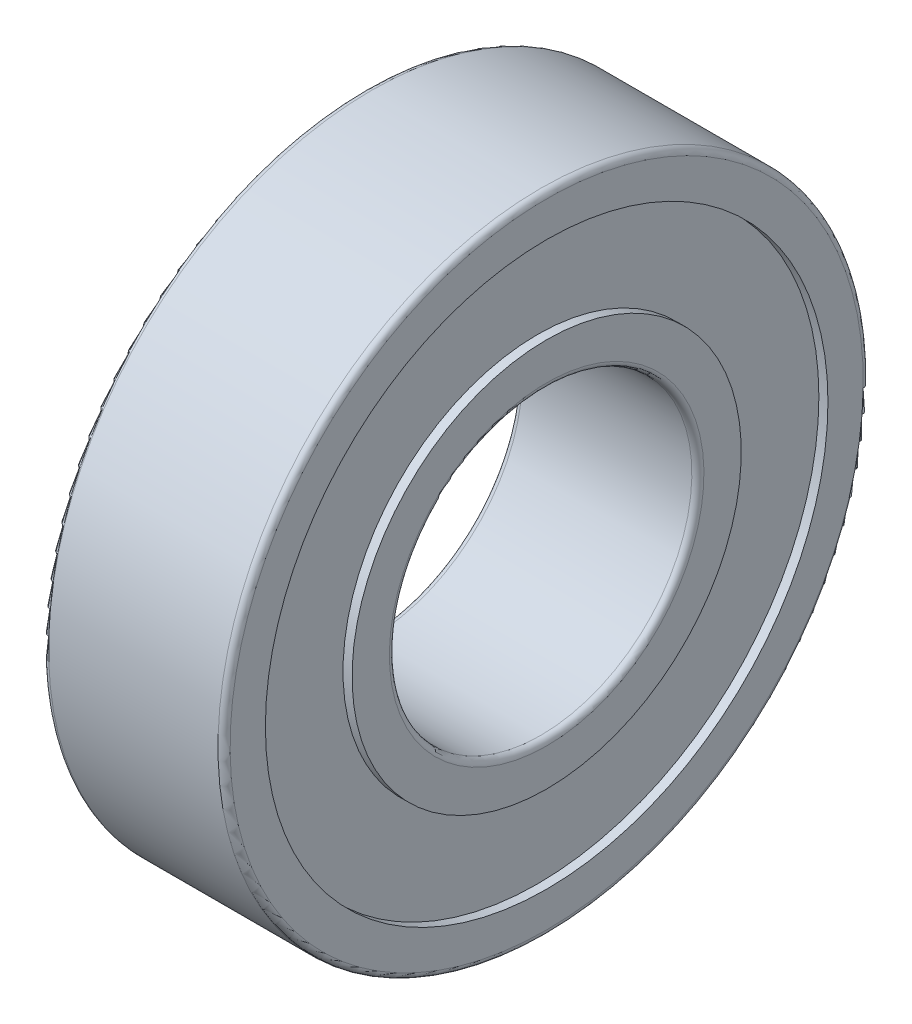
ISO-10303-21;
HEADER;
FILE_DESCRIPTION(('STEP AP214'),'2;1');
FILE_NAME('part.step','',(''),(''),'','','');
FILE_SCHEMA(('AUTOMOTIVE_DESIGN { 1 0 10303 214 1 1 1 1 }'));
ENDSEC;
DATA;
#1=APPLICATION_CONTEXT('core data for automotive mechanical design processes');
#2=APPLICATION_PROTOCOL_DEFINITION('international standard','automotive_design',2000,#1);
#3=PRODUCT_CONTEXT('',#1,'mechanical');
#4=PRODUCT('Part','Part','',(#3));
#5=PRODUCT_RELATED_PRODUCT_CATEGORY('part','',(#4));
#6=PRODUCT_DEFINITION_FORMATION('','',#4);
#7=PRODUCT_DEFINITION_CONTEXT('part definition',#1,'design');
#8=PRODUCT_DEFINITION('design','',#6,#7);
#9=PRODUCT_DEFINITION_SHAPE('','',#8);
#10=(LENGTH_UNIT() NAMED_UNIT(*) SI_UNIT(.MILLI.,.METRE.));
#11=(NAMED_UNIT(*) PLANE_ANGLE_UNIT() SI_UNIT($,.RADIAN.));
#12=(NAMED_UNIT(*) SI_UNIT($,.STERADIAN.) SOLID_ANGLE_UNIT());
#13=UNCERTAINTY_MEASURE_WITH_UNIT(LENGTH_MEASURE(1.E-05),#10,'distance_accuracy_value','');
#14=(GEOMETRIC_REPRESENTATION_CONTEXT(3) GLOBAL_UNCERTAINTY_ASSIGNED_CONTEXT((#13)) GLOBAL_UNIT_ASSIGNED_CONTEXT((#10,
#11,#12)) REPRESENTATION_CONTEXT('',''));
#15=CARTESIAN_POINT('',(0.,0.,0.));
#16=DIRECTION('',(0.,0.,1.));
#17=DIRECTION('',(1.,0.,0.));
#18=AXIS2_PLACEMENT_3D('',#15,#16,#17);
#19=CARTESIAN_POINT('',(0.,0.,0.));
#20=DIRECTION('',(-1.,0.,0.));
#21=DIRECTION('',(0.,-1.,0.));
#22=AXIS2_PLACEMENT_3D('',#19,#20,#21);
#23=CYLINDRICAL_SURFACE('',#22,7.5);
#24=CARTESIAN_POINT('',(0.3,0.,0.));
#25=DIRECTION('',(1.,0.,0.));
#26=DIRECTION('',(0.,1.,0.));
#27=AXIS2_PLACEMENT_3D('',#24,#25,#26);
#28=CIRCLE('',#27,7.5);
#29=CARTESIAN_POINT('',(0.3,7.5,0.));
#30=VERTEX_POINT('',#29);
#31=EDGE_CURVE('E57',#30,#30,#28,.F.);
#32=ORIENTED_EDGE('',*,*,#31,.T.);
#33=EDGE_LOOP('',(#32));
#34=FACE_BOUND('',#33,.T.);
#35=CARTESIAN_POINT('',(8.7,0.,0.));
#36=DIRECTION('',(-1.,0.,0.));
#37=DIRECTION('',(0.,-1.,0.));
#38=AXIS2_PLACEMENT_3D('',#35,#36,#37);
#39=CIRCLE('',#38,7.5);
#40=CARTESIAN_POINT('',(8.7,-7.5,0.));
#41=VERTEX_POINT('',#40);
#42=EDGE_CURVE('E60',#41,#41,#39,.F.);
#43=ORIENTED_EDGE('',*,*,#42,.T.);
#44=EDGE_LOOP('',(#43));
#45=FACE_BOUND('',#44,.T.);
#46=ADVANCED_FACE('F31',(#34,#45),#23,.F.);
#47=CARTESIAN_POINT('',(0.,7.5,0.));
#48=DIRECTION('',(1.,0.,0.));
#49=DIRECTION('',(0.,1.,0.));
#50=AXIS2_PLACEMENT_3D('',#47,#48,#49);
#51=PLANE('',#50);
#52=CARTESIAN_POINT('',(0.,0.,0.));
#53=DIRECTION('',(1.,0.,0.));
#54=DIRECTION('',(0.,1.,0.));
#55=AXIS2_PLACEMENT_3D('',#52,#53,#54);
#56=CIRCLE('',#55,7.8);
#57=CARTESIAN_POINT('',(0.,7.8,0.));
#58=VERTEX_POINT('',#57);
#59=EDGE_CURVE('E54',#58,#58,#56,.T.);
#60=ORIENTED_EDGE('',*,*,#59,.T.);
#61=EDGE_LOOP('',(#60));
#62=FACE_BOUND('',#61,.T.);
#63=CARTESIAN_POINT('',(0.,0.,0.));
#64=DIRECTION('',(-1.,0.,0.));
#65=DIRECTION('',(0.,-1.,0.));
#66=AXIS2_PLACEMENT_3D('',#63,#64,#65);
#67=CIRCLE('',#66,9.65);
#68=CARTESIAN_POINT('',(0.,-9.65,0.));
#69=VERTEX_POINT('',#68);
#70=EDGE_CURVE('E63',#69,#69,#67,.T.);
#71=ORIENTED_EDGE('',*,*,#70,.T.);
#72=EDGE_LOOP('',(#71));
#73=FACE_BOUND('',#72,.T.);
#74=ADVANCED_FACE('F106',(#62,#73),#51,.F.);
#75=CARTESIAN_POINT('',(0.,0.,0.));
#76=DIRECTION('',(-1.,0.,0.));
#77=DIRECTION('',(0.,-1.,0.));
#78=AXIS2_PLACEMENT_3D('',#75,#76,#77);
#79=CYLINDRICAL_SURFACE('',#78,9.65);
#80=ORIENTED_EDGE('',*,*,#70,.F.);
#81=EDGE_LOOP('',(#80));
#82=FACE_BOUND('',#81,.T.);
#83=CARTESIAN_POINT('',(0.45,0.,0.));
#84=DIRECTION('',(-1.,0.,0.));
#85=DIRECTION('',(0.,-1.,0.));
#86=AXIS2_PLACEMENT_3D('',#83,#84,#85);
#87=CIRCLE('',#86,9.65);
#88=CARTESIAN_POINT('',(0.45,-9.65,0.));
#89=VERTEX_POINT('',#88);
#90=EDGE_CURVE('E66',#89,#89,#87,.T.);
#91=ORIENTED_EDGE('',*,*,#90,.T.);
#92=EDGE_LOOP('',(#91));
#93=FACE_BOUND('',#92,.T.);
#94=ADVANCED_FACE('F112',(#82,#93),#79,.T.);
#95=CARTESIAN_POINT('',(0.45,9.65,0.));
#96=DIRECTION('',(1.,0.,0.));
#97=DIRECTION('',(0.,1.,0.));
#98=AXIS2_PLACEMENT_3D('',#95,#96,#97);
#99=PLANE('',#98);
#100=ORIENTED_EDGE('',*,*,#90,.F.);
#101=EDGE_LOOP('',(#100));
#102=FACE_BOUND('',#101,.T.);
#103=CARTESIAN_POINT('',(0.45,0.,0.));
#104=DIRECTION('',(-1.,0.,0.));
#105=DIRECTION('',(0.,-1.,0.));
#106=AXIS2_PLACEMENT_3D('',#103,#104,#105);
#107=CIRCLE('',#106,13.95);
#108=CARTESIAN_POINT('',(0.45,-13.95,0.));
#109=VERTEX_POINT('',#108);
#110=EDGE_CURVE('E69',#109,#109,#107,.T.);
#111=ORIENTED_EDGE('',*,*,#110,.T.);
#112=EDGE_LOOP('',(#111));
#113=FACE_BOUND('',#112,.T.);
#114=ADVANCED_FACE('F139',(#102,#113),#99,.F.);
#115=CARTESIAN_POINT('',(0.,0.,0.));
#116=DIRECTION('',(-1.,0.,0.));
#117=DIRECTION('',(0.,-1.,0.));
#118=AXIS2_PLACEMENT_3D('',#115,#116,#117);
#119=CYLINDRICAL_SURFACE('',#118,13.95);
#120=ORIENTED_EDGE('',*,*,#110,.F.);
#121=EDGE_LOOP('',(#120));
#122=FACE_BOUND('',#121,.T.);
#123=CARTESIAN_POINT('',(0.,0.,0.));
#124=DIRECTION('',(-1.,0.,0.));
#125=DIRECTION('',(0.,-1.,0.));
#126=AXIS2_PLACEMENT_3D('',#123,#124,#125);
#127=CIRCLE('',#126,13.95);
#128=CARTESIAN_POINT('',(0.,-13.95,0.));
#129=VERTEX_POINT('',#128);
#130=EDGE_CURVE('E72',#129,#129,#127,.T.);
#131=ORIENTED_EDGE('',*,*,#130,.T.);
#132=EDGE_LOOP('',(#131));
#133=FACE_BOUND('',#132,.T.);
#134=ADVANCED_FACE('F134',(#122,#133),#119,.F.);
#135=CARTESIAN_POINT('',(0.,13.95,0.));
#136=DIRECTION('',(1.,0.,0.));
#137=DIRECTION('',(0.,1.,0.));
#138=AXIS2_PLACEMENT_3D('',#135,#136,#137);
#139=PLANE('',#138);
#140=CARTESIAN_POINT('',(0.,0.,0.));
#141=DIRECTION('',(1.,0.,0.));
#142=DIRECTION('',(0.,1.,0.));
#143=AXIS2_PLACEMENT_3D('',#140,#141,#142);
#144=CIRCLE('',#143,15.7);
#145=CARTESIAN_POINT('',(0.,15.7,0.));
#146=VERTEX_POINT('',#145);
#147=EDGE_CURVE('E46',#146,#146,#144,.F.);
#148=ORIENTED_EDGE('',*,*,#147,.T.);
#149=EDGE_LOOP('',(#148));
#150=FACE_BOUND('',#149,.T.);
#151=ORIENTED_EDGE('',*,*,#130,.F.);
#152=EDGE_LOOP('',(#151));
#153=FACE_BOUND('',#152,.T.);
#154=ADVANCED_FACE('F130',(#150,#153),#139,.F.);
#155=CARTESIAN_POINT('',(0.,0.,0.));
#156=DIRECTION('',(-1.,0.,0.));
#157=DIRECTION('',(0.,-1.,0.));
#158=AXIS2_PLACEMENT_3D('',#155,#156,#157);
#159=CYLINDRICAL_SURFACE('',#158,16.);
#160=CARTESIAN_POINT('',(0.3,0.,0.));
#161=DIRECTION('',(1.,0.,0.));
#162=DIRECTION('',(0.,1.,0.));
#163=AXIS2_PLACEMENT_3D('',#160,#161,#162);
#164=CIRCLE('',#163,16.);
#165=CARTESIAN_POINT('',(0.3,16.,0.));
#166=VERTEX_POINT('',#165);
#167=EDGE_CURVE('E38',#166,#166,#164,.T.);
#168=ORIENTED_EDGE('',*,*,#167,.T.);
#169=EDGE_LOOP('',(#168));
#170=FACE_BOUND('',#169,.T.);
#171=CARTESIAN_POINT('',(8.7,0.,0.));
#172=DIRECTION('',(-1.,0.,0.));
#173=DIRECTION('',(0.,-1.,0.));
#174=AXIS2_PLACEMENT_3D('',#171,#172,#173);
#175=CIRCLE('',#174,16.);
#176=CARTESIAN_POINT('',(8.7,-16.,0.));
#177=VERTEX_POINT('',#176);
#178=EDGE_CURVE('E42',#177,#177,#175,.T.);
#179=ORIENTED_EDGE('',*,*,#178,.T.);
#180=EDGE_LOOP('',(#179));
#181=FACE_BOUND('',#180,.T.);
#182=ADVANCED_FACE('F133',(#170,#181),#159,.T.);
#183=CARTESIAN_POINT('',(9.,16.,0.));
#184=DIRECTION('',(-1.,0.,0.));
#185=DIRECTION('',(0.,-1.,0.));
#186=AXIS2_PLACEMENT_3D('',#183,#184,#185);
#187=PLANE('',#186);
#188=CARTESIAN_POINT('',(9.,0.,0.));
#189=DIRECTION('',(-1.,0.,0.));
#190=DIRECTION('',(0.,-1.,0.));
#191=AXIS2_PLACEMENT_3D('',#188,#189,#190);
#192=CIRCLE('',#191,15.7);
#193=CARTESIAN_POINT('',(9.,-15.7,0.));
#194=VERTEX_POINT('',#193);
#195=EDGE_CURVE('E10',#194,#194,#192,.F.);
#196=ORIENTED_EDGE('',*,*,#195,.T.);
#197=EDGE_LOOP('',(#196));
#198=FACE_BOUND('',#197,.T.);
#199=CARTESIAN_POINT('',(9.,0.,0.));
#200=DIRECTION('',(-1.,0.,0.));
#201=DIRECTION('',(0.,-1.,0.));
#202=AXIS2_PLACEMENT_3D('',#199,#200,#201);
#203=CIRCLE('',#202,13.95);
#204=CARTESIAN_POINT('',(9.,-13.95,0.));
#205=VERTEX_POINT('',#204);
#206=EDGE_CURVE('E75',#205,#205,#203,.T.);
#207=ORIENTED_EDGE('',*,*,#206,.T.);
#208=EDGE_LOOP('',(#207));
#209=FACE_BOUND('',#208,.T.);
#210=ADVANCED_FACE('F179',(#198,#209),#187,.F.);
#211=CARTESIAN_POINT('',(0.,0.,0.));
#212=DIRECTION('',(-1.,0.,0.));
#213=DIRECTION('',(0.,-1.,0.));
#214=AXIS2_PLACEMENT_3D('',#211,#212,#213);
#215=CYLINDRICAL_SURFACE('',#214,13.95);
#216=ORIENTED_EDGE('',*,*,#206,.F.);
#217=EDGE_LOOP('',(#216));
#218=FACE_BOUND('',#217,.T.);
#219=CARTESIAN_POINT('',(8.55,0.,0.));
#220=DIRECTION('',(-1.,0.,0.));
#221=DIRECTION('',(0.,-1.,0.));
#222=AXIS2_PLACEMENT_3D('',#219,#220,#221);
#223=CIRCLE('',#222,13.95);
#224=CARTESIAN_POINT('',(8.55,-13.95,0.));
#225=VERTEX_POINT('',#224);
#226=EDGE_CURVE('E78',#225,#225,#223,.T.);
#227=ORIENTED_EDGE('',*,*,#226,.T.);
#228=EDGE_LOOP('',(#227));
#229=FACE_BOUND('',#228,.T.);
#230=ADVANCED_FACE('F174',(#218,#229),#215,.F.);
#231=CARTESIAN_POINT('',(8.55,13.95,0.));
#232=DIRECTION('',(-1.,0.,0.));
#233=DIRECTION('',(0.,-1.,0.));
#234=AXIS2_PLACEMENT_3D('',#231,#232,#233);
#235=PLANE('',#234);
#236=ORIENTED_EDGE('',*,*,#226,.F.);
#237=EDGE_LOOP('',(#236));
#238=FACE_BOUND('',#237,.T.);
#239=CARTESIAN_POINT('',(8.55,0.,0.));
#240=DIRECTION('',(-1.,0.,0.));
#241=DIRECTION('',(0.,-1.,0.));
#242=AXIS2_PLACEMENT_3D('',#239,#240,#241);
#243=CIRCLE('',#242,9.65);
#244=CARTESIAN_POINT('',(8.55,-9.65,0.));
#245=VERTEX_POINT('',#244);
#246=EDGE_CURVE('E81',#245,#245,#243,.T.);
#247=ORIENTED_EDGE('',*,*,#246,.T.);
#248=EDGE_LOOP('',(#247));
#249=FACE_BOUND('',#248,.T.);
#250=ADVANCED_FACE('F102',(#238,#249),#235,.F.);
#251=CARTESIAN_POINT('',(0.,0.,0.));
#252=DIRECTION('',(-1.,0.,0.));
#253=DIRECTION('',(0.,-1.,0.));
#254=AXIS2_PLACEMENT_3D('',#251,#252,#253);
#255=CYLINDRICAL_SURFACE('',#254,9.65);
#256=ORIENTED_EDGE('',*,*,#246,.F.);
#257=EDGE_LOOP('',(#256));
#258=FACE_BOUND('',#257,.T.);
#259=CARTESIAN_POINT('',(9.,0.,0.));
#260=DIRECTION('',(-1.,0.,0.));
#261=DIRECTION('',(0.,-1.,0.));
#262=AXIS2_PLACEMENT_3D('',#259,#260,#261);
#263=CIRCLE('',#262,9.65);
#264=CARTESIAN_POINT('',(9.,-9.65,0.));
#265=VERTEX_POINT('',#264);
#266=EDGE_CURVE('E84',#265,#265,#263,.T.);
#267=ORIENTED_EDGE('',*,*,#266,.T.);
#268=EDGE_LOOP('',(#267));
#269=FACE_BOUND('',#268,.T.);
#270=ADVANCED_FACE('F88',(#258,#269),#255,.T.);
#271=CARTESIAN_POINT('',(9.,9.65,0.));
#272=DIRECTION('',(-1.,0.,0.));
#273=DIRECTION('',(0.,-1.,0.));
#274=AXIS2_PLACEMENT_3D('',#271,#272,#273);
#275=PLANE('',#274);
#276=CARTESIAN_POINT('',(9.,0.,0.));
#277=DIRECTION('',(-1.,0.,0.));
#278=DIRECTION('',(0.,-1.,0.));
#279=AXIS2_PLACEMENT_3D('',#276,#277,#278);
#280=CIRCLE('',#279,7.8);
#281=CARTESIAN_POINT('',(9.,-7.8,0.));
#282=VERTEX_POINT('',#281);
#283=EDGE_CURVE('E51',#282,#282,#280,.T.);
#284=ORIENTED_EDGE('',*,*,#283,.T.);
#285=EDGE_LOOP('',(#284));
#286=FACE_BOUND('',#285,.T.);
#287=ORIENTED_EDGE('',*,*,#266,.F.);
#288=EDGE_LOOP('',(#287));
#289=FACE_BOUND('',#288,.T.);
#290=ADVANCED_FACE('F90',(#286,#289),#275,.F.);
#291=CARTESIAN_POINT('',(0.3,0.,0.));
#292=DIRECTION('',(1.,0.,0.));
#293=DIRECTION('',(0.,1.,0.));
#294=AXIS2_PLACEMENT_3D('',#291,#292,#293);
#295=TOROIDAL_SURFACE('',#294,7.8,0.3);
#296=ORIENTED_EDGE('',*,*,#59,.F.);
#297=EDGE_LOOP('',(#296));
#298=FACE_BOUND('',#297,.T.);
#299=ORIENTED_EDGE('',*,*,#31,.F.);
#300=EDGE_LOOP('',(#299));
#301=FACE_BOUND('',#300,.T.);
#302=ADVANCED_FACE('F92',(#298,#301),#295,.T.);
#303=CARTESIAN_POINT('',(8.7,0.,0.));
#304=DIRECTION('',(-1.,0.,0.));
#305=DIRECTION('',(0.,-1.,0.));
#306=AXIS2_PLACEMENT_3D('',#303,#304,#305);
#307=TOROIDAL_SURFACE('',#306,7.8,0.3);
#308=ORIENTED_EDGE('',*,*,#42,.F.);
#309=EDGE_LOOP('',(#308));
#310=FACE_BOUND('',#309,.T.);
#311=ORIENTED_EDGE('',*,*,#283,.F.);
#312=EDGE_LOOP('',(#311));
#313=FACE_BOUND('',#312,.T.);
#314=ADVANCED_FACE('F99',(#310,#313),#307,.T.);
#315=CARTESIAN_POINT('',(0.3,0.,0.));
#316=DIRECTION('',(1.,0.,0.));
#317=DIRECTION('',(0.,1.,0.));
#318=AXIS2_PLACEMENT_3D('',#315,#316,#317);
#319=TOROIDAL_SURFACE('',#318,15.7,0.3);
#320=ORIENTED_EDGE('',*,*,#167,.F.);
#321=EDGE_LOOP('',(#320));
#322=FACE_BOUND('',#321,.T.);
#323=ORIENTED_EDGE('',*,*,#147,.F.);
#324=EDGE_LOOP('',(#323));
#325=FACE_BOUND('',#324,.T.);
#326=ADVANCED_FACE('F119',(#322,#325),#319,.T.);
#327=CARTESIAN_POINT('',(8.7,0.,0.));
#328=DIRECTION('',(-1.,0.,0.));
#329=DIRECTION('',(0.,-1.,0.));
#330=AXIS2_PLACEMENT_3D('',#327,#328,#329);
#331=TOROIDAL_SURFACE('',#330,15.7,0.3);
#332=ORIENTED_EDGE('',*,*,#195,.F.);
#333=EDGE_LOOP('',(#332));
#334=FACE_BOUND('',#333,.T.);
#335=ORIENTED_EDGE('',*,*,#178,.F.);
#336=EDGE_LOOP('',(#335));
#337=FACE_BOUND('',#336,.T.);
#338=ADVANCED_FACE('F33',(#334,#337),#331,.T.);
#339=CLOSED_SHELL('',(#46,#74,#94,#114,#134,#154,#182,#210,#230,#250,#270,#290,#302,#314,#326,#338));
#340=MANIFOLD_SOLID_BREP('B2',#339);
#341=ADVANCED_BREP_SHAPE_REPRESENTATION('',(#18,#340),#14);
#342=SHAPE_DEFINITION_REPRESENTATION(#9,#341);
ENDSEC;
END-ISO-10303-21;
